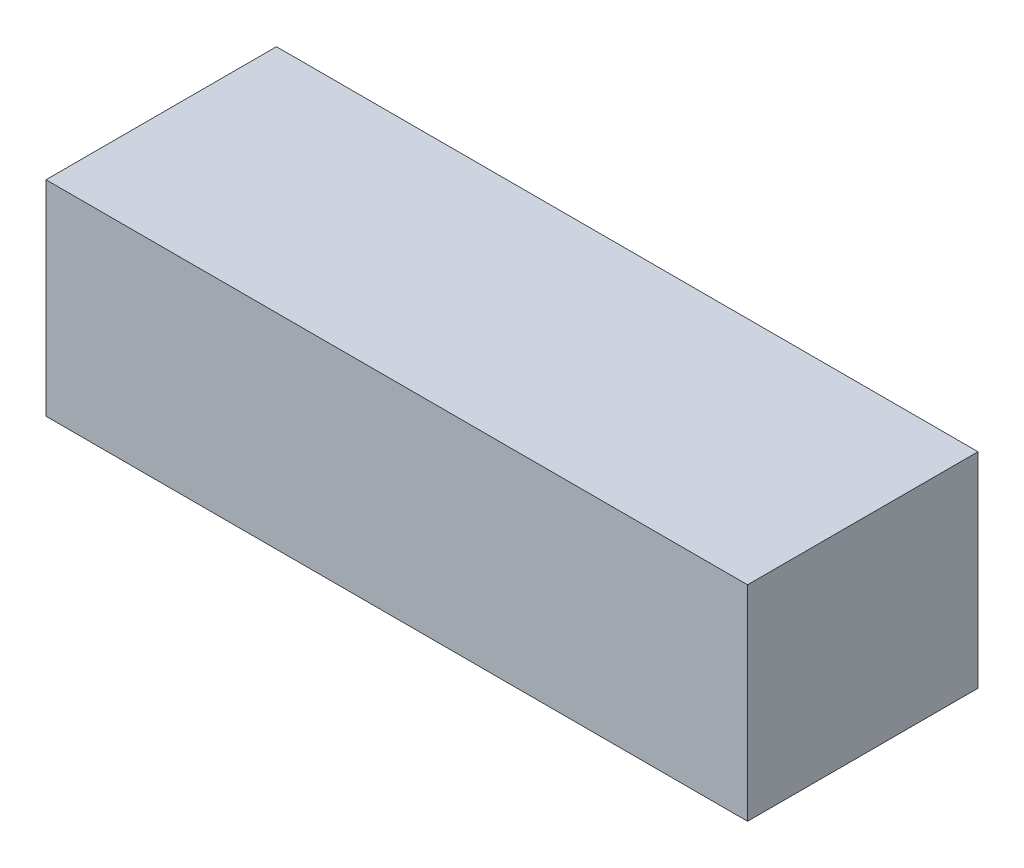
ISO-10303-21;
HEADER;
FILE_DESCRIPTION(('STEP AP214'),'2;1');
FILE_NAME('part.step','',(''),(''),'','','');
FILE_SCHEMA(('AUTOMOTIVE_DESIGN { 1 0 10303 214 1 1 1 1 }'));
ENDSEC;
DATA;
#1=APPLICATION_CONTEXT('core data for automotive mechanical design processes');
#2=APPLICATION_PROTOCOL_DEFINITION('international standard','automotive_design',2000,#1);
#3=PRODUCT_CONTEXT('',#1,'mechanical');
#4=PRODUCT('Part','Part','',(#3));
#5=PRODUCT_RELATED_PRODUCT_CATEGORY('part','',(#4));
#6=PRODUCT_DEFINITION_FORMATION('','',#4);
#7=PRODUCT_DEFINITION_CONTEXT('part definition',#1,'design');
#8=PRODUCT_DEFINITION('design','',#6,#7);
#9=PRODUCT_DEFINITION_SHAPE('','',#8);
#10=(LENGTH_UNIT() NAMED_UNIT(*) SI_UNIT(.MILLI.,.METRE.));
#11=(NAMED_UNIT(*) PLANE_ANGLE_UNIT() SI_UNIT($,.RADIAN.));
#12=(NAMED_UNIT(*) SI_UNIT($,.STERADIAN.) SOLID_ANGLE_UNIT());
#13=UNCERTAINTY_MEASURE_WITH_UNIT(LENGTH_MEASURE(1.E-05),#10,'distance_accuracy_value','');
#14=(GEOMETRIC_REPRESENTATION_CONTEXT(3) GLOBAL_UNCERTAINTY_ASSIGNED_CONTEXT((#13)) GLOBAL_UNIT_ASSIGNED_CONTEXT((#10,
#11,#12)) REPRESENTATION_CONTEXT('',''));
#15=CARTESIAN_POINT('',(0.,0.,0.));
#16=DIRECTION('',(0.,0.,1.));
#17=DIRECTION('',(1.,0.,0.));
#18=AXIS2_PLACEMENT_3D('',#15,#16,#17);
#19=CARTESIAN_POINT('',(-62.2830585059781,17.8256955810147,22.5));
#20=DIRECTION('',(1.,0.,0.));
#21=DIRECTION('',(0.,1.,0.));
#22=AXIS2_PLACEMENT_3D('',#19,#20,#21);
#23=PLANE('',#22);
#24=DIRECTION('',(0.,-1.,0.));
#25=VECTOR('',#24,1.);
#26=CARTESIAN_POINT('',(-62.2830585059781,17.8256955810147,-22.5));
#27=LINE('',#26,#25);
#28=CARTESIAN_POINT('',(-62.2830585059781,17.8256955810147,-22.5));
#29=VERTEX_POINT('',#28);
#30=CARTESIAN_POINT('',(-62.2830585059781,-22.1743044189853,-22.5));
#31=VERTEX_POINT('',#30);
#32=EDGE_CURVE('E98',#29,#31,#27,.T.);
#33=ORIENTED_EDGE('',*,*,#32,.T.);
#34=DIRECTION('',(0.,0.,-1.));
#35=VECTOR('',#34,1.);
#36=CARTESIAN_POINT('',(-62.2830585059781,-22.1743044189853,22.5));
#37=LINE('',#36,#35);
#38=CARTESIAN_POINT('',(-62.2830585059781,-22.1743044189853,22.5));
#39=VERTEX_POINT('',#38);
#40=EDGE_CURVE('E11',#39,#31,#37,.T.);
#41=ORIENTED_EDGE('',*,*,#40,.F.);
#42=DIRECTION('',(0.,-1.,0.));
#43=VECTOR('',#42,1.);
#44=CARTESIAN_POINT('',(-62.2830585059781,17.8256955810147,22.5));
#45=LINE('',#44,#43);
#46=CARTESIAN_POINT('',(-62.2830585059781,17.8256955810147,22.5));
#47=VERTEX_POINT('',#46);
#48=EDGE_CURVE('E86',#47,#39,#45,.T.);
#49=ORIENTED_EDGE('',*,*,#48,.F.);
#50=DIRECTION('',(0.,0.,-1.));
#51=VECTOR('',#50,1.);
#52=CARTESIAN_POINT('',(-62.2830585059781,17.8256955810147,22.5));
#53=LINE('',#52,#51);
#54=EDGE_CURVE('E94',#47,#29,#53,.T.);
#55=ORIENTED_EDGE('',*,*,#54,.T.);
#56=EDGE_LOOP('',(#33,#41,#49,#55));
#57=FACE_BOUND('',#56,.T.);
#58=ADVANCED_FACE('F35',(#57),#23,.F.);
#59=CARTESIAN_POINT('',(-62.2830585059781,-22.1743044189853,22.5));
#60=DIRECTION('',(0.,1.,0.));
#61=DIRECTION('',(0.,0.,1.));
#62=AXIS2_PLACEMENT_3D('',#59,#60,#61);
#63=PLANE('',#62);
#64=DIRECTION('',(1.,0.,0.));
#65=VECTOR('',#64,1.);
#66=CARTESIAN_POINT('',(-62.2830585059781,-22.1743044189853,-22.5));
#67=LINE('',#66,#65);
#68=CARTESIAN_POINT('',(74.7169414940219,-22.1743044189853,-22.5));
#69=VERTEX_POINT('',#68);
#70=EDGE_CURVE('E90',#31,#69,#67,.T.);
#71=ORIENTED_EDGE('',*,*,#70,.T.);
#72=DIRECTION('',(0.,0.,-1.));
#73=VECTOR('',#72,1.);
#74=CARTESIAN_POINT('',(74.7169414940219,-22.1743044189853,22.5));
#75=LINE('',#74,#73);
#76=CARTESIAN_POINT('',(74.7169414940219,-22.1743044189853,22.5));
#77=VERTEX_POINT('',#76);
#78=EDGE_CURVE('E43',#77,#69,#75,.T.);
#79=ORIENTED_EDGE('',*,*,#78,.F.);
#80=DIRECTION('',(1.,0.,0.));
#81=VECTOR('',#80,1.);
#82=CARTESIAN_POINT('',(-62.2830585059781,-22.1743044189853,22.5));
#83=LINE('',#82,#81);
#84=EDGE_CURVE('E81',#39,#77,#83,.T.);
#85=ORIENTED_EDGE('',*,*,#84,.F.);
#86=ORIENTED_EDGE('',*,*,#40,.T.);
#87=EDGE_LOOP('',(#71,#79,#85,#86));
#88=FACE_BOUND('',#87,.T.);
#89=ADVANCED_FACE('F89',(#88),#63,.F.);
#90=CARTESIAN_POINT('',(74.7169414940219,17.8256955810147,22.5));
#91=DIRECTION('',(-1.,0.,0.));
#92=DIRECTION('',(0.,-1.,0.));
#93=AXIS2_PLACEMENT_3D('',#90,#91,#92);
#94=PLANE('',#93);
#95=DIRECTION('',(0.,1.,0.));
#96=VECTOR('',#95,1.);
#97=CARTESIAN_POINT('',(74.7169414940219,17.8256955810147,-22.5));
#98=LINE('',#97,#96);
#99=CARTESIAN_POINT('',(74.7169414940219,17.8256955810147,-22.5));
#100=VERTEX_POINT('',#99);
#101=EDGE_CURVE('E68',#69,#100,#98,.T.);
#102=ORIENTED_EDGE('',*,*,#101,.T.);
#103=DIRECTION('',(0.,0.,-1.));
#104=VECTOR('',#103,1.);
#105=CARTESIAN_POINT('',(74.7169414940219,17.8256955810147,22.5));
#106=LINE('',#105,#104);
#107=CARTESIAN_POINT('',(74.7169414940219,17.8256955810147,22.5));
#108=VERTEX_POINT('',#107);
#109=EDGE_CURVE('E91',#108,#100,#106,.T.);
#110=ORIENTED_EDGE('',*,*,#109,.F.);
#111=DIRECTION('',(0.,1.,0.));
#112=VECTOR('',#111,1.);
#113=CARTESIAN_POINT('',(74.7169414940219,17.8256955810147,22.5));
#114=LINE('',#113,#112);
#115=EDGE_CURVE('E84',#77,#108,#114,.T.);
#116=ORIENTED_EDGE('',*,*,#115,.F.);
#117=ORIENTED_EDGE('',*,*,#78,.T.);
#118=EDGE_LOOP('',(#102,#110,#116,#117));
#119=FACE_BOUND('',#118,.T.);
#120=ADVANCED_FACE('F92',(#119),#94,.F.);
#121=CARTESIAN_POINT('',(-62.2830585059781,17.8256955810147,22.5));
#122=DIRECTION('',(0.,-1.,0.));
#123=DIRECTION('',(0.,0.,-1.));
#124=AXIS2_PLACEMENT_3D('',#121,#122,#123);
#125=PLANE('',#124);
#126=DIRECTION('',(-1.,0.,0.));
#127=VECTOR('',#126,1.);
#128=CARTESIAN_POINT('',(-62.2830585059781,17.8256955810147,-22.5));
#129=LINE('',#128,#127);
#130=EDGE_CURVE('E74',#100,#29,#129,.T.);
#131=ORIENTED_EDGE('',*,*,#130,.T.);
#132=ORIENTED_EDGE('',*,*,#54,.F.);
#133=DIRECTION('',(-1.,0.,0.));
#134=VECTOR('',#133,1.);
#135=CARTESIAN_POINT('',(-62.2830585059781,17.8256955810147,22.5));
#136=LINE('',#135,#134);
#137=EDGE_CURVE('E51',#108,#47,#136,.T.);
#138=ORIENTED_EDGE('',*,*,#137,.F.);
#139=ORIENTED_EDGE('',*,*,#109,.T.);
#140=EDGE_LOOP('',(#131,#132,#138,#139));
#141=FACE_BOUND('',#140,.T.);
#142=ADVANCED_FACE('F105',(#141),#125,.F.);
#143=CARTESIAN_POINT('',(0.,0.,22.5));
#144=DIRECTION('',(0.,0.,1.));
#145=DIRECTION('',(1.,0.,0.));
#146=AXIS2_PLACEMENT_3D('',#143,#144,#145);
#147=PLANE('',#146);
#148=ORIENTED_EDGE('',*,*,#48,.T.);
#149=ORIENTED_EDGE('',*,*,#84,.T.);
#150=ORIENTED_EDGE('',*,*,#115,.T.);
#151=ORIENTED_EDGE('',*,*,#137,.T.);
#152=EDGE_LOOP('',(#148,#149,#150,#151));
#153=FACE_BOUND('',#152,.T.);
#154=ADVANCED_FACE('F82',(#153),#147,.T.);
#155=CARTESIAN_POINT('',(0.,0.,-22.5));
#156=DIRECTION('',(0.,0.,1.));
#157=DIRECTION('',(1.,0.,0.));
#158=AXIS2_PLACEMENT_3D('',#155,#156,#157);
#159=PLANE('',#158);
#160=ORIENTED_EDGE('',*,*,#32,.F.);
#161=ORIENTED_EDGE('',*,*,#130,.F.);
#162=ORIENTED_EDGE('',*,*,#101,.F.);
#163=ORIENTED_EDGE('',*,*,#70,.F.);
#164=EDGE_LOOP('',(#160,#161,#162,#163));
#165=FACE_BOUND('',#164,.T.);
#166=ADVANCED_FACE('F108',(#165),#159,.F.);
#167=CLOSED_SHELL('',(#58,#89,#120,#142,#154,#166));
#168=MANIFOLD_SOLID_BREP('B2',#167);
#169=ADVANCED_BREP_SHAPE_REPRESENTATION('',(#18,#168),#14);
#170=SHAPE_DEFINITION_REPRESENTATION(#9,#169);
ENDSEC;
END-ISO-10303-21;
